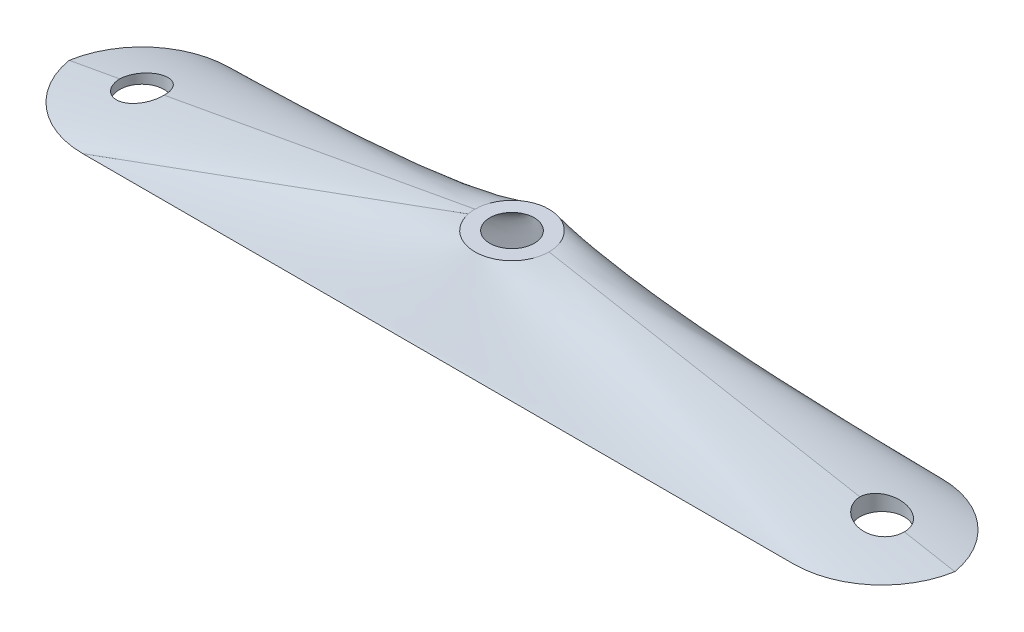
ISO-10303-21;
HEADER;
FILE_DESCRIPTION(('STEP AP214'),'2;1');
FILE_NAME('part.step','',(''),(''),'','','');
FILE_SCHEMA(('AUTOMOTIVE_DESIGN { 1 0 10303 214 1 1 1 1 }'));
ENDSEC;
DATA;
#1=APPLICATION_CONTEXT('core data for automotive mechanical design processes');
#2=APPLICATION_PROTOCOL_DEFINITION('international standard','automotive_design',2000,#1);
#3=PRODUCT_CONTEXT('',#1,'mechanical');
#4=PRODUCT('Part','Part','',(#3));
#5=PRODUCT_RELATED_PRODUCT_CATEGORY('part','',(#4));
#6=PRODUCT_DEFINITION_FORMATION('','',#4);
#7=PRODUCT_DEFINITION_CONTEXT('part definition',#1,'design');
#8=PRODUCT_DEFINITION('design','',#6,#7);
#9=PRODUCT_DEFINITION_SHAPE('','',#8);
#10=(LENGTH_UNIT() NAMED_UNIT(*) SI_UNIT(.MILLI.,.METRE.));
#11=(NAMED_UNIT(*) PLANE_ANGLE_UNIT() SI_UNIT($,.RADIAN.));
#12=(NAMED_UNIT(*) SI_UNIT($,.STERADIAN.) SOLID_ANGLE_UNIT());
#13=UNCERTAINTY_MEASURE_WITH_UNIT(LENGTH_MEASURE(1.E-05),#10,'distance_accuracy_value','');
#14=(GEOMETRIC_REPRESENTATION_CONTEXT(3) GLOBAL_UNCERTAINTY_ASSIGNED_CONTEXT((#13)) GLOBAL_UNIT_ASSIGNED_CONTEXT((#10,
#11,#12)) REPRESENTATION_CONTEXT('',''));
#15=CARTESIAN_POINT('',(0.,0.,0.));
#16=DIRECTION('',(0.,0.,1.));
#17=DIRECTION('',(1.,0.,0.));
#18=AXIS2_PLACEMENT_3D('',#15,#16,#17);
#19=CARTESIAN_POINT('',(24.,0.,-0.999999999999999));
#20=DIRECTION('',(0.,1.,0.));
#21=DIRECTION('',(0.,0.,1.));
#22=AXIS2_PLACEMENT_3D('',#19,#20,#21);
#23=PLANE('',#22);
#24=DIRECTION('',(0.,0.,1.));
#25=VECTOR('',#24,1.);
#26=CARTESIAN_POINT('',(-21.,0.,-2.));
#27=LINE('',#26,#25);
#28=CARTESIAN_POINT('',(-21.,0.,-2.));
#29=VERTEX_POINT('',#28);
#30=CARTESIAN_POINT('',(-21.,0.,2.));
#31=VERTEX_POINT('',#30);
#32=EDGE_CURVE('E391',#29,#31,#27,.T.);
#33=ORIENTED_EDGE('',*,*,#32,.T.);
#34=DIRECTION('',(1.,0.,0.));
#35=VECTOR('',#34,1.);
#36=CARTESIAN_POINT('',(-21.,0.,2.));
#37=LINE('',#36,#35);
#38=CARTESIAN_POINT('',(21.,0.,2.));
#39=VERTEX_POINT('',#38);
#40=EDGE_CURVE('E156',#31,#39,#37,.T.);
#41=ORIENTED_EDGE('',*,*,#40,.T.);
#42=DIRECTION('',(0.,0.,-1.));
#43=VECTOR('',#42,1.);
#44=CARTESIAN_POINT('',(21.,0.,-2.));
#45=LINE('',#44,#43);
#46=CARTESIAN_POINT('',(21.,0.,-2.));
#47=VERTEX_POINT('',#46);
#48=EDGE_CURVE('E241',#39,#47,#45,.T.);
#49=ORIENTED_EDGE('',*,*,#48,.T.);
#50=DIRECTION('',(-1.,0.,0.));
#51=VECTOR('',#50,1.);
#52=CARTESIAN_POINT('',(-21.,0.,-2.));
#53=LINE('',#52,#51);
#54=EDGE_CURVE('E299',#47,#29,#53,.T.);
#55=ORIENTED_EDGE('',*,*,#54,.T.);
#56=EDGE_LOOP('',(#33,#41,#49,#55));
#57=FACE_BOUND('',#56,.T.);
#58=CARTESIAN_POINT('',(25.,0.,0.));
#59=DIRECTION('',(0.,1.,0.));
#60=DIRECTION('',(0.,0.,1.));
#61=AXIS2_PLACEMENT_3D('',#58,#59,#60);
#62=CIRCLE('',#61,1.5);
#63=CARTESIAN_POINT('',(25.,0.,1.49999999999999));
#64=VERTEX_POINT('',#63);
#65=EDGE_CURVE('E406',#64,#64,#62,.T.);
#66=ORIENTED_EDGE('',*,*,#65,.T.);
#67=EDGE_LOOP('',(#66));
#68=FACE_BOUND('',#67,.T.);
#69=CARTESIAN_POINT('',(24.,0.,-0.999999999999999));
#70=DIRECTION('',(0.,1.,0.));
#71=DIRECTION('',(0.,0.,1.));
#72=AXIS2_PLACEMENT_3D('',#69,#70,#71);
#73=CIRCLE('',#72,6.);
#74=CARTESIAN_POINT('',(24.,0.,5.));
#75=VERTEX_POINT('',#74);
#76=CARTESIAN_POINT('',(29.9160797830996,0.,0.));
#77=VERTEX_POINT('',#76);
#78=EDGE_CURVE('E568',#75,#77,#73,.T.);
#79=ORIENTED_EDGE('',*,*,#78,.F.);
#80=DIRECTION('',(1.,0.,0.));
#81=VECTOR('',#80,1.);
#82=CARTESIAN_POINT('',(-24.,0.,5.));
#83=LINE('',#82,#81);
#84=CARTESIAN_POINT('',(-24.,0.,5.));
#85=VERTEX_POINT('',#84);
#86=EDGE_CURVE('E554',#85,#75,#83,.T.);
#87=ORIENTED_EDGE('',*,*,#86,.F.);
#88=CARTESIAN_POINT('',(-24.,0.,-1.));
#89=DIRECTION('',(0.,1.,0.));
#90=DIRECTION('',(0.,0.,1.));
#91=AXIS2_PLACEMENT_3D('',#88,#89,#90);
#92=CIRCLE('',#91,6.);
#93=CARTESIAN_POINT('',(-29.9160797830996,0.,0.));
#94=VERTEX_POINT('',#93);
#95=EDGE_CURVE('E550',#94,#85,#92,.T.);
#96=ORIENTED_EDGE('',*,*,#95,.F.);
#97=CARTESIAN_POINT('',(-24.,0.,1.));
#98=DIRECTION('',(0.,1.,0.));
#99=DIRECTION('',(0.,0.,1.));
#100=AXIS2_PLACEMENT_3D('',#97,#98,#99);
#101=CIRCLE('',#100,6.);
#102=CARTESIAN_POINT('',(-24.,0.,-5.));
#103=VERTEX_POINT('',#102);
#104=EDGE_CURVE('E535',#103,#94,#101,.T.);
#105=ORIENTED_EDGE('',*,*,#104,.F.);
#106=DIRECTION('',(1.,0.,0.));
#107=VECTOR('',#106,1.);
#108=CARTESIAN_POINT('',(-24.,0.,-5.));
#109=LINE('',#108,#107);
#110=CARTESIAN_POINT('',(24.,0.,-5.));
#111=VERTEX_POINT('',#110);
#112=EDGE_CURVE('E524',#103,#111,#109,.T.);
#113=ORIENTED_EDGE('',*,*,#112,.T.);
#114=CARTESIAN_POINT('',(24.,0.,1.));
#115=DIRECTION('',(0.,-1.,0.));
#116=DIRECTION('',(0.,0.,-1.));
#117=AXIS2_PLACEMENT_3D('',#114,#115,#116);
#118=CIRCLE('',#117,6.);
#119=EDGE_CURVE('E513',#111,#77,#118,.T.);
#120=ORIENTED_EDGE('',*,*,#119,.T.);
#121=EDGE_LOOP('',(#79,#87,#96,#105,#113,#120));
#122=FACE_BOUND('',#121,.T.);
#123=CARTESIAN_POINT('',(-25.,0.,0.));
#124=DIRECTION('',(0.,1.,0.));
#125=DIRECTION('',(0.,0.,1.));
#126=AXIS2_PLACEMENT_3D('',#123,#124,#125);
#127=CIRCLE('',#126,1.5);
#128=CARTESIAN_POINT('',(-25.,0.,1.5));
#129=VERTEX_POINT('',#128);
#130=EDGE_CURVE('E264',#129,#129,#127,.T.);
#131=ORIENTED_EDGE('',*,*,#130,.T.);
#132=EDGE_LOOP('',(#131));
#133=FACE_BOUND('',#132,.T.);
#134=ADVANCED_FACE('F151',(#57,#68,#122,#133),#23,.F.);
#135=CARTESIAN_POINT('',(29.9160797830996,0.,0.));
#136=CARTESIAN_POINT('',(2.5,5.,0.));
#137=CARTESIAN_POINT('',(29.8576069399161,0.,-0.345930005418267));
#138=CARTESIAN_POINT('',(2.5,5.,-0.0213953530212336));
#139=CARTESIAN_POINT('',(29.6739535574753,0.,-1.06141026314804));
#140=CARTESIAN_POINT('',(2.49944265383587,5.,-0.0625543013431825));
#141=CARTESIAN_POINT('',(29.1630847247937,0.,-2.13603988544615));
#142=CARTESIAN_POINT('',(2.49722734976918,5.,-0.12103731016739));
#143=CARTESIAN_POINT('',(28.4277559052906,0.,-3.10895181990004));
#144=CARTESIAN_POINT('',(2.49392551455387,5.,-0.17790476483572));
#145=CARTESIAN_POINT('',(27.5395613102074,0.,-3.88951021670276));
#146=CARTESIAN_POINT('',(2.48921396726683,4.99999999999999,-0.235103940194016));
#147=CARTESIAN_POINT('',(26.5934125945931,0.,-4.44399398395558));
#148=CARTESIAN_POINT('',(2.48276952698495,5.,-0.294582111088122));
#149=CARTESIAN_POINT('',(25.6628136034882,0.,-4.7904265958617));
#150=CARTESIAN_POINT('',(2.47456553986549,5.,-0.356902074488963));
#151=CARTESIAN_POINT('',(24.7884785601569,0.,-4.96786078241977));
#152=CARTESIAN_POINT('',(2.46457535206569,5.,-0.422626627367463));
#153=CARTESIAN_POINT('',(24.2543127953814,0.,-5.));
#154=CARTESIAN_POINT('',(2.45419931934819,5.,-0.477493939259954));
#155=CARTESIAN_POINT('',(21.903475735512,0.,-5.));
#156=CARTESIAN_POINT('',(2.39181911951797,5.,-0.776918898445019));
#157=CARTESIAN_POINT('',(17.7877435421834,0.,-5.));
#158=CARTESIAN_POINT('',(2.19056393390965,4.99999999999999,-1.30083484455612));
#159=CARTESIAN_POINT('',(11.7782607328345,0.,-5.));
#160=CARTESIAN_POINT('',(1.63222763938408,5.00000000000001,-1.95877479182776));
#161=CARTESIAN_POINT('',(5.86505987783089,0.,-5.));
#162=CARTESIAN_POINT('',(0.871931661804083,4.99999999999999,-2.3973297100366));
#163=CARTESIAN_POINT('',(0.,0.,-5.));
#164=CARTESIAN_POINT('',(0.,5.00000000000001,-2.55144611330746));
#165=CARTESIAN_POINT('',(-5.86505987783087,0.,-5.));
#166=CARTESIAN_POINT('',(-0.871931661804084,4.99999999999999,-2.3973297100366));
#167=CARTESIAN_POINT('',(-11.7782607328345,0.,-5.));
#168=CARTESIAN_POINT('',(-1.63222763938409,5.00000000000001,-1.95877479182776));
#169=CARTESIAN_POINT('',(-17.7877435421834,0.,-5.));
#170=CARTESIAN_POINT('',(-2.19056393390965,4.99999999999999,-1.30083484455612));
#171=CARTESIAN_POINT('',(-21.903475735512,0.,-5.));
#172=CARTESIAN_POINT('',(-2.39181911951797,5.,-0.776918898445019));
#173=CARTESIAN_POINT('',(-24.2543127953814,0.,-5.));
#174=CARTESIAN_POINT('',(-2.45419931934819,5.,-0.477493939259956));
#175=CARTESIAN_POINT('',(-24.7884785601569,0.,-4.96786078241976));
#176=CARTESIAN_POINT('',(-2.46457535206569,5.,-0.422626627367464));
#177=CARTESIAN_POINT('',(-25.6628136034882,0.,-4.79042659586171));
#178=CARTESIAN_POINT('',(-2.47456553986549,5.,-0.356902074488964));
#179=CARTESIAN_POINT('',(-26.593412594593,0.,-4.44399398395558));
#180=CARTESIAN_POINT('',(-2.48276952698495,5.,-0.294582111088123));
#181=CARTESIAN_POINT('',(-27.5395613102074,0.,-3.88951021670275));
#182=CARTESIAN_POINT('',(-2.48921396726683,5.,-0.235103940194017));
#183=CARTESIAN_POINT('',(-28.4277559052906,0.,-3.10895181990002));
#184=CARTESIAN_POINT('',(-2.49392551455387,5.,-0.17790476483572));
#185=CARTESIAN_POINT('',(-29.1630847247937,0.,-2.13603988544614));
#186=CARTESIAN_POINT('',(-2.49722734976919,5.,-0.12103731016739));
#187=CARTESIAN_POINT('',(-29.6739535574753,0.,-1.06141026314803));
#188=CARTESIAN_POINT('',(-2.49944265383587,5.,-0.0625543013431825));
#189=CARTESIAN_POINT('',(-29.8576069399161,0.,-0.345930005418259));
#190=CARTESIAN_POINT('',(-2.5,5.,-0.0213953530212336));
#191=CARTESIAN_POINT('',(-29.9160797830996,0.,0.));
#192=CARTESIAN_POINT('',(-2.5,5.,0.));
#193=B_SPLINE_SURFACE_WITH_KNOTS('',3,1,((#135,#136),(#137,#138),(#139,#140),(#141,#142),(#143,
#144),(#145,#146),(#147,#148),(#149,#150),(#151,#152),(#153,#154),(#155,#156),(#157,#158),(#159,
#160),(#161,#162),(#163,#164),(#165,#166),(#167,#168),(#169,#170),(#171,#172),(#173,#174),(#175,
#176),(#177,#178),(#179,#180),(#181,#182),(#183,#184),(#185,#186),(#187,#188),(#189,#190),(#191,
#192)),.UNSPECIFIED.,.F.,.F.,.F.,(4,1,1,1,1,1,1,1,2,1,1,1,1,1,1,1,2,1,1,1,1,1,1,1,4),(2,2),(0.,
0.0122024073057627,0.0244048146115255,0.0366072219172882,0.0488096292230509,0.0610120365288137,
0.0732144438345764,0.0854168511403391,0.0976192584461019,0.198214443834576,0.298809629223051,
0.399404814611525,0.5,0.600595185388475,0.701190370776949,0.801785556165424,0.902380741553898,
0.914583148859661,0.926785556165423,0.938987963471186,0.951190370776949,0.963392778082712,
0.975595185388475,0.987797592694237,1.),(0.,1.),.UNSPECIFIED.);
#194=DIRECTION('',(0.983773405242329,0.179415403847921,0.));
#195=VECTOR('',#194,1.);
#196=CARTESIAN_POINT('',(-16.2080398915498,2.5,0.));
#197=LINE('',#196,#195);
#198=CARTESIAN_POINT('',(-26.5,0.623006609647637,0.));
#199=VERTEX_POINT('',#198);
#200=EDGE_CURVE('E540',#94,#199,#197,.T.);
#201=CARTESIAN_POINT('',(-26.5,0.623006609647637,0.));
#202=CARTESIAN_POINT('',(-26.4999998743897,0.62172910550306,-0.0418189708600754));
#203=CARTESIAN_POINT('',(-26.4982500459415,0.620676120662407,-0.0836249605767046));
#204=CARTESIAN_POINT('',(-26.4912668133967,0.619027661504748,-0.166952268218727));
#205=CARTESIAN_POINT('',(-26.4860335498904,0.618432168725603,-0.208473597564593));
#206=CARTESIAN_POINT('',(-26.4651549900874,0.617345696551539,-0.332092330074409));
#207=CARTESIAN_POINT('',(-26.4443308020649,0.617550480349324,-0.413383326001903));
#208=CARTESIAN_POINT('',(-26.3894513516417,0.619880070847785,-0.57133933385011));
#209=CARTESIAN_POINT('',(-26.3553894685041,0.622005839020947,-0.648002008748126));
#210=CARTESIAN_POINT('',(-26.2750314448184,0.628224976518404,-0.794525571839239));
#211=CARTESIAN_POINT('',(-26.2287378255027,0.632317940502171,-0.864387857687406));
#212=CARTESIAN_POINT('',(-26.1252574919269,0.642504453747967,-0.99537181675843));
#213=CARTESIAN_POINT('',(-26.0680680758812,0.648598499481718,-1.0564913154733));
#214=CARTESIAN_POINT('',(-25.9444696758924,0.66280116410627,-1.16829896629494));
#215=CARTESIAN_POINT('',(-25.8780591470789,0.670910120747769,-1.21898536694006));
#216=CARTESIAN_POINT('',(-25.7376018153849,0.689145757592799,-1.30878832374084));
#217=CARTESIAN_POINT('',(-25.6635181499454,0.699282418558914,-1.34784517167671));
#218=CARTESIAN_POINT('',(-25.5101424184695,0.721433858396896,-1.41304614638015));
#219=CARTESIAN_POINT('',(-25.4308504465361,0.733448603341222,-1.43919050637602));
#220=CARTESIAN_POINT('',(-25.2683802716908,0.759305509552603,-1.47818455966865));
#221=CARTESIAN_POINT('',(-25.1851682791829,0.773166786444903,-1.49088068500494));
#222=CARTESIAN_POINT('',(-25.0180381576904,0.80230738701011,-1.50222926028419));
#223=CARTESIAN_POINT('',(-24.9341199504764,0.817586869713198,-1.5008801333759));
#224=CARTESIAN_POINT('',(-24.7665274514225,0.84941229511642,-1.48414746368594));
#225=CARTESIAN_POINT('',(-24.6828786569812,0.865974619220452,-1.46853918273686));
#226=CARTESIAN_POINT('',(-24.519512266627,0.899614788075291,-1.42348774701228));
#227=CARTESIAN_POINT('',(-24.4397950394074,0.916692680933768,-1.3940432974283));
#228=CARTESIAN_POINT('',(-24.2853823084191,0.95099017653906,-1.32162019577626));
#229=CARTESIAN_POINT('',(-24.2107681271329,0.968208624147053,-1.2784659759435));
#230=CARTESIAN_POINT('',(-24.1051938685166,0.993417405888537,-1.20464627436589));
#231=CARTESIAN_POINT('',(-24.0710548721857,1.00171858176494,-1.17851961675077));
#232=CARTESIAN_POINT('',(-24.0050663919763,1.01804083594838,-1.12336887117912));
#233=CARTESIAN_POINT('',(-23.9732193681032,1.02606160868475,-1.09434174760343));
#234=CARTESIAN_POINT('',(-23.881661901733,1.04952167615035,-1.00334635409865));
#235=CARTESIAN_POINT('',(-23.8257437154181,1.06440476006868,-0.937330141058736));
#236=CARTESIAN_POINT('',(-23.7259236654144,1.09193701781833,-0.796355928783183));
#237=CARTESIAN_POINT('',(-23.6820186860421,1.10458677057241,-0.721400255295108));
#238=CARTESIAN_POINT('',(-23.6266396918862,1.12130623218727,-0.604727251383807));
#239=CARTESIAN_POINT('',(-23.6100377469512,1.12646430166789,-0.565526933372189));
#240=CARTESIAN_POINT('',(-23.5802084408856,1.13603440946633,-0.485797716996678));
#241=CARTESIAN_POINT('',(-23.5669784110916,1.14044703681722,-0.445269898118525));
#242=CARTESIAN_POINT('',(-23.5440163540445,1.14847114268338,-0.363215570544322));
#243=CARTESIAN_POINT('',(-23.5342800525531,1.15208359804552,-0.321690348924266));
#244=CARTESIAN_POINT('',(-23.5183737547473,1.15847200837184,-0.237908097485299));
#245=CARTESIAN_POINT('',(-23.5122025127761,1.16124825535063,-0.195651328595962));
#246=CARTESIAN_POINT('',(-23.5052301834282,1.1649955767869,-0.127742986944667));
#247=CARTESIAN_POINT('',(-23.5032681895719,1.16624428432764,-0.102220174296166));
#248=CARTESIAN_POINT('',(-23.5006539685504,1.16842489093066,-0.0511342084233681));
#249=CARTESIAN_POINT('',(-23.499999696597,1.16935728269395,-0.0255711808255543));
#250=CARTESIAN_POINT('',(-23.4999999999999,1.1701307834417,0.));
#251=B_SPLINE_CURVE_WITH_KNOTS('',3,(#201,#202,#203,#204,#205,#206,#207,#208,#209,#210,#211,
#212,#213,#214,#215,#216,#217,#218,#219,#220,#221,#222,#223,#224,#225,#226,#227,#228,#229,#230,
#231,#232,#233,#234,#235,#236,#237,#238,#239,#240,#241,#242,#243,#244,#245,#246,#247,#248,#249,
#250),.UNSPECIFIED.,.F.,.F.,(4,2,2,2,2,2,2,2,2,2,2,2,2,2,2,2,2,2,2,2,2,2,2,2,4),(0.,
0.125438728943334,0.250872395528046,0.501328292608193,0.751909614919592,1.00243932709193,
1.25303124312694,1.5036651931591,1.7555645931109,2.007459443032,2.26220070209884,
2.51697056110809,2.77582644141553,3.03470655065296,3.29704542705875,3.42826074586477,
3.55961486199715,3.82161825209999,4.08355362580487,4.21206823370931,4.34048081213585,
4.468735750243,4.59694584802877,4.6737992901233,4.75053246785094),.UNSPECIFIED.);
#252=CARTESIAN_POINT('',(-23.5,1.17013078344168,0.));
#253=VERTEX_POINT('',#252);
#254=EDGE_CURVE('E400',#199,#253,#251,.T.);
#255=CARTESIAN_POINT('',(-2.5,5.,0.));
#256=VERTEX_POINT('',#255);
#257=EDGE_CURVE('E426',#253,#256,#197,.T.);
#258=CARTESIAN_POINT('',(0.,5.,0.));
#259=DIRECTION('',(0.,1.,0.));
#260=DIRECTION('',(0.,0.,1.));
#261=AXIS2_PLACEMENT_3D('',#258,#259,#260);
#262=CIRCLE('',#261,2.5);
#263=CARTESIAN_POINT('',(2.5,5.,0.));
#264=VERTEX_POINT('',#263);
#265=EDGE_CURVE('E469',#264,#256,#262,.T.);
#266=DIRECTION('',(-0.983773405242329,0.179415403847921,0.));
#267=VECTOR('',#266,1.);
#268=CARTESIAN_POINT('',(16.2080398915498,2.5,0.));
#269=LINE('',#268,#267);
#270=CARTESIAN_POINT('',(23.5,1.17013078344168,0.));
#271=VERTEX_POINT('',#270);
#272=EDGE_CURVE('E491',#271,#264,#269,.T.);
#273=CARTESIAN_POINT('',(23.5,1.17013078344168,0.));
#274=CARTESIAN_POINT('',(23.4999990055124,1.16887244974125,-0.0416163962723675));
#275=CARTESIAN_POINT('',(23.5017327878285,1.16719266962609,-0.0832006210960265));
#276=CARTESIAN_POINT('',(23.5086380171164,1.16300954066388,-0.16603275531397));
#277=CARTESIAN_POINT('',(23.5138087824821,1.16050635516036,-0.207280729750348));
#278=CARTESIAN_POINT('',(23.5343937803506,1.15180487766047,-0.329922813625943));
#279=CARTESIAN_POINT('',(23.5548810863767,1.14440786602526,-0.410435745184424));
#280=CARTESIAN_POINT('',(23.6087094476079,1.12673833529857,-0.5666933870399));
#281=CARTESIAN_POINT('',(23.6420503473457,1.11646585098707,-0.642438154996132));
#282=CARTESIAN_POINT('',(23.7008356108937,1.0992645742903,-0.750912093947971));
#283=CARTESIAN_POINT('',(23.7219000457348,1.0932301433054,-0.786221909068305));
#284=CARTESIAN_POINT('',(23.7668219814728,1.0806226700505,-0.854961488519094));
#285=CARTESIAN_POINT('',(23.7906819255418,1.07404915817175,-0.888389569943044));
#286=CARTESIAN_POINT('',(23.8670286251157,1.05340592791849,-0.986567628472779));
#287=CARTESIAN_POINT('',(23.923639201553,1.03860332051024,-1.04802614418805));
#288=CARTESIAN_POINT('',(24.0460731232658,1.00772998401198,-1.16057793008955));
#289=CARTESIAN_POINT('',(24.1118981077364,0.991659029512012,-1.21166935205389));
#290=CARTESIAN_POINT('',(24.2170648719994,0.966886309641801,-1.28016813750353));
#291=CARTESIAN_POINT('',(24.2537199595903,0.958401199144179,-1.30187413078569));
#292=CARTESIAN_POINT('',(24.3286894426985,0.941361973347474,-1.34206930616426));
#293=CARTESIAN_POINT('',(24.3670022167477,0.932807931854102,-1.3605615467592));
#294=CARTESIAN_POINT('',(24.4841218979899,0.90714827533164,-1.41105868403802));
#295=CARTESIAN_POINT('',(24.5651367121102,0.890038841018895,-1.43810124577735));
#296=CARTESIAN_POINT('',(24.7315556529251,0.856277450908081,-1.47829368394371));
#297=CARTESIAN_POINT('',(24.8169976253152,0.839632397342551,-1.49129096388559));
#298=CARTESIAN_POINT('',(24.989079013734,0.807515953255104,-1.50243476339974));
#299=CARTESIAN_POINT('',(25.0757184188531,0.792044552048495,-1.50058141818547));
#300=CARTESIAN_POINT('',(25.2469828004204,0.762813506984785,-1.48201214902406));
#301=CARTESIAN_POINT('',(25.3316182324852,0.749041421087427,-1.46541258618189));
#302=CARTESIAN_POINT('',(25.4970467996433,0.723367401076671,-1.4178692703339));
#303=CARTESIAN_POINT('',(25.5778402838678,0.71146529680422,-1.38692682347275));
#304=CARTESIAN_POINT('',(25.7319036619169,0.689892912995107,-1.31206800553675));
#305=CARTESIAN_POINT('',(25.8052744503639,0.680189520201958,-1.26837054815775));
#306=CARTESIAN_POINT('',(25.9090181203322,0.667209280644687,-1.19394498870273));
#307=CARTESIAN_POINT('',(25.9425518266732,0.663144516225288,-1.1676519507305));
#308=CARTESIAN_POINT('',(26.0073305437786,0.655535380126306,-1.11225128017766));
#309=CARTESIAN_POINT('',(26.0385732561092,0.651991527565287,-1.08314088720114));
#310=CARTESIAN_POINT('',(26.1275628359912,0.642247794153419,-0.992806726668506));
#311=CARTESIAN_POINT('',(26.1816420858412,0.636803549638195,-0.927808943312896));
#312=CARTESIAN_POINT('',(26.2781607988918,0.627945556463901,-0.789563983079695));
#313=CARTESIAN_POINT('',(26.3206013985936,0.624531609510475,-0.716317612653434));
#314=CARTESIAN_POINT('',(26.374468811164,0.62091086496187,-0.60216044134114));
#315=CARTESIAN_POINT('',(26.390760660185,0.619954573214684,-0.563506374570518));
#316=CARTESIAN_POINT('',(26.4200453149559,0.618526256885001,-0.485001979311077));
#317=CARTESIAN_POINT('',(26.4330407955717,0.618053838707349,-0.445152650283458));
#318=CARTESIAN_POINT('',(26.4669159578352,0.617353938603754,-0.324244983677833));
#319=CARTESIAN_POINT('',(26.482756824367,0.617839043411815,-0.241673125351246));
#320=CARTESIAN_POINT('',(26.4944031418302,0.619687456745152,-0.132165350397939));
#321=CARTESIAN_POINT('',(26.4965031635354,0.620224629078121,-0.105749950654129));
#322=CARTESIAN_POINT('',(26.4992992760538,0.621480331208117,-0.0528935351899835));
#323=CARTESIAN_POINT('',(26.4999977104562,0.622198556000061,-0.0264526363163654));
#324=CARTESIAN_POINT('',(26.5000000000001,0.623006609647621,0.));
#325=B_SPLINE_CURVE_WITH_KNOTS('',3,(#273,#274,#275,#276,#277,#278,#279,#280,#281,#282,#283,
#284,#285,#286,#287,#288,#289,#290,#291,#292,#293,#294,#295,#296,#297,#298,#299,#300,#301,#302,
#303,#304,#305,#306,#307,#308,#309,#310,#311,#312,#313,#314,#315,#316,#317,#318,#319,#320,#321,
#322,#323,#324),.UNSPECIFIED.,.F.,.F.,(4,2,2,2,2,2,2,2,2,2,2,2,2,2,2,2,2,2,2,2,2,2,2,2,2,4),(0.,
0.124830020515418,0.249635292719342,0.498592211517164,0.747546119213432,0.872091861661552,
0.996747276048309,1.2500932168264,1.50348428393657,1.63366021218493,1.76371156659404,
2.02371864462089,2.28652304436737,2.54932505130882,2.81007155119858,3.07079431069125,
3.32728187916504,3.45556425642934,3.58397362010861,3.83686616054474,4.08973399750694,
4.21547333950836,4.34111032048539,4.59188002222927,4.67136962408625,4.75072620054595),.UNSPECIFIED.);
#326=CARTESIAN_POINT('',(26.5,0.62300660964764,0.));
#327=VERTEX_POINT('',#326);
#328=EDGE_CURVE('E162',#271,#327,#325,.T.);
#329=EDGE_CURVE('E498',#77,#327,#269,.T.);
#330=ORIENTED_EDGE('',*,*,#200,.T.);
#331=ORIENTED_EDGE('',*,*,#254,.T.);
#332=ORIENTED_EDGE('',*,*,#257,.T.);
#333=ORIENTED_EDGE('',*,*,#265,.F.);
#334=ORIENTED_EDGE('',*,*,#272,.F.);
#335=ORIENTED_EDGE('',*,*,#328,.T.);
#336=ORIENTED_EDGE('',*,*,#329,.F.);
#337=ORIENTED_EDGE('',*,*,#119,.F.);
#338=ORIENTED_EDGE('',*,*,#112,.F.);
#339=ORIENTED_EDGE('',*,*,#104,.T.);
#340=EDGE_LOOP('',(#330,#331,#332,#333,#334,#335,#336,#337,#338,#339));
#341=FACE_BOUND('',#340,.T.);
#342=ADVANCED_FACE('F314',(#341),#193,.T.);
#343=CARTESIAN_POINT('',(-29.9160797830996,0.,0.));
#344=CARTESIAN_POINT('',(-2.5,5.,0.));
#345=CARTESIAN_POINT('',(-29.4283201494261,0.,2.88562490778812));
#346=CARTESIAN_POINT('',(-2.5,5.,0.171312223353755));
#347=CARTESIAN_POINT('',(-26.9265578020412,0.,5.));
#348=CARTESIAN_POINT('',(-2.4823909060784,5.,0.342174322954961));
#349=CARTESIAN_POINT('',(-24.,0.,5.));
#350=CARTESIAN_POINT('',(-2.44745104934401,5.,0.509885635280003));
#351=B_SPLINE_SURFACE_WITH_KNOTS('',3,1,((#343,#344),(#345,#346),(#347,#348),(#349,#350)),
.UNSPECIFIED.,.F.,.F.,.F.,(4,4),(2,2),(0.,1.),(0.,1.),.UNSPECIFIED.);
#352=CARTESIAN_POINT('',(-23.5,1.17013078344168,0.));
#353=CARTESIAN_POINT('',(-23.4999990059217,1.16887152196048,0.0416189344031349));
#354=CARTESIAN_POINT('',(-23.501732999575,1.16719261916546,0.0832057726741453));
#355=CARTESIAN_POINT('',(-23.5086391121327,1.1630135947006,0.166043278253204));
#356=CARTESIAN_POINT('',(-23.5138105529667,1.16051363504153,0.207294010237384));
#357=CARTESIAN_POINT('',(-23.5343983735954,1.15182343249517,0.329944740223334));
#358=CARTESIAN_POINT('',(-23.5548886222827,1.14443608561857,0.410463626477934));
#359=CARTESIAN_POINT('',(-23.6087251593269,1.12678792002075,0.566732986329323));
#360=CARTESIAN_POINT('',(-23.6420713310124,1.1165271273771,0.642483503193178));
#361=CARTESIAN_POINT('',(-23.7008663029489,1.09934643144347,0.750965402824763));
#362=CARTESIAN_POINT('',(-23.7219342590849,1.09331937476611,0.78627774092438));
#363=CARTESIAN_POINT('',(-23.766863906307,1.08072815643662,0.85502215458776));
#364=CARTESIAN_POINT('',(-23.7907280407293,1.07416352657707,0.888452547354115));
#365=CARTESIAN_POINT('',(-23.8670850065256,1.05354788922268,0.986632664864866));
#366=CARTESIAN_POINT('',(-23.9237017971246,1.03876389218198,1.04809067251872));
#367=CARTESIAN_POINT('',(-24.0461475177322,1.00792094199789,1.16063932377743));
#368=CARTESIAN_POINT('',(-24.111978086556,0.991861762263554,1.21172811908549));
#369=CARTESIAN_POINT('',(-24.2171485408967,0.967103262365083,1.28021919440723));
#370=CARTESIAN_POINT('',(-24.2538020442842,0.958622790934876,1.30192106474793));
#371=CARTESIAN_POINT('',(-24.3287676539575,0.941591531544038,1.34210831106658));
#372=CARTESIAN_POINT('',(-24.3670781392714,0.933040818649157,1.36059674557403));
#373=CARTESIAN_POINT('',(-24.484190028924,0.907389509964173,1.41108313719679));
#374=CARTESIAN_POINT('',(-24.5651983637084,0.890283472441014,1.43811939613062));
#375=CARTESIAN_POINT('',(-24.7316088482863,0.856524533291335,1.47830322950464));
#376=CARTESIAN_POINT('',(-24.8170490958568,0.839878549888748,1.4912971408807));
#377=CARTESIAN_POINT('',(-24.9891261021834,0.807758212627922,1.50243496909127));
#378=CARTESIAN_POINT('',(-25.0757628497008,0.792283847773588,1.50057902531487));
#379=CARTESIAN_POINT('',(-25.2470249940425,0.763044907941986,1.48200516750757));
#380=CARTESIAN_POINT('',(-25.3316607955867,0.749267966562602,1.46540300081642));
#381=CARTESIAN_POINT('',(-25.4970895383542,0.723582694397343,1.41785433830287));
#382=CARTESIAN_POINT('',(-25.5778828259605,0.711674194957636,1.3869091381443));
#383=CARTESIAN_POINT('',(-25.7319462246559,0.690085609379294,1.31204438955473));
#384=CARTESIAN_POINT('',(-25.8053171506631,0.680372494539666,1.26834355405968));
#385=CARTESIAN_POINT('',(-25.9090603403015,0.667374252134377,1.1939128734935));
#386=CARTESIAN_POINT('',(-25.9425937666288,0.663302916137086,1.16761812466296));
#387=CARTESIAN_POINT('',(-26.0073717269073,0.655679594980342,1.11221401278142));
#388=CARTESIAN_POINT('',(-26.0386139620976,0.65212812794422,1.08310188916118));
#389=CARTESIAN_POINT('',(-26.1276038508193,0.642361357140222,0.992760521869018));
#390=CARTESIAN_POINT('',(-26.1816833746414,0.636901546736457,0.927756818059279));
#391=CARTESIAN_POINT('',(-26.2782011879119,0.628018049421878,0.789499114806748));
#392=CARTESIAN_POINT('',(-26.3206406177541,0.624594163010769,0.716245924568505));
#393=CARTESIAN_POINT('',(-26.374503442811,0.620959548963399,0.602081348625343));
#394=CARTESIAN_POINT('',(-26.390792849047,0.619998827083918,0.563426884104372));
#395=CARTESIAN_POINT('',(-26.4200726601256,0.618561867160931,0.484921859107078));
#396=CARTESIAN_POINT('',(-26.433065739461,0.618085235399076,0.445072297826251));
#397=CARTESIAN_POINT('',(-26.4669337392701,0.617372980233686,0.324164247854728));
#398=CARTESIAN_POINT('',(-26.4827699149231,0.617850208706707,0.24159246761276));
#399=CARTESIAN_POINT('',(-26.4944088202916,0.619692072452122,0.132098413157894));
#400=CARTESIAN_POINT('',(-26.4965067119544,0.620227718025404,0.105696342418225));
#401=CARTESIAN_POINT('',(-26.4992999878662,0.621481177051346,0.0528666732682709));
#402=CARTESIAN_POINT('',(-26.499997712473,0.622198684259703,0.0264391914498094));
#403=CARTESIAN_POINT('',(-26.5,0.623006609647637,0.));
#404=B_SPLINE_CURVE_WITH_KNOTS('',3,(#352,#353,#354,#355,#356,#357,#358,#359,#360,#361,#362,
#363,#364,#365,#366,#367,#368,#369,#370,#371,#372,#373,#374,#375,#376,#377,#378,#379,#380,#381,
#382,#383,#384,#385,#386,#387,#388,#389,#390,#391,#392,#393,#394,#395,#396,#397,#398,#399,#400,
#401,#402,#403),.UNSPECIFIED.,.F.,.F.,(4,2,2,2,2,2,2,2,2,2,2,2,2,2,2,2,2,2,2,2,2,2,2,2,2,4),(0.,
0.124837769472589,0.249650920765132,0.498624508474808,0.747595836730841,0.872150136278317,
0.996814096222531,1.25016135315438,1.50355372927798,1.63371678729632,1.7637552702474,
2.0237367954112,2.28653531354458,2.54933136490609,2.81008270638061,3.07081049772865,
3.32730690273513,3.45559365424901,3.58400740373255,3.83691681674656,4.08980144306852,
4.21553935311719,4.34117491639245,4.59194151849031,4.67139070751598,4.75070698746072),.UNSPECIFIED.);
#405=EDGE_CURVE('E12',#253,#199,#404,.T.);
#406=DIRECTION('',(-0.954668551350484,-0.221474627789078,0.198889281531351));
#407=VECTOR('',#406,1.);
#408=CARTESIAN_POINT('',(-13.223725524672,2.5,2.75494281764));
#409=LINE('',#408,#407);
#410=CARTESIAN_POINT('',(-2.44745104934401,5.,0.509885635280003));
#411=VERTEX_POINT('',#410);
#412=EDGE_CURVE('E499',#411,#85,#409,.T.);
#413=EDGE_CURVE('E473',#256,#411,#262,.T.);
#414=ORIENTED_EDGE('',*,*,#257,.F.);
#415=ORIENTED_EDGE('',*,*,#405,.T.);
#416=ORIENTED_EDGE('',*,*,#200,.F.);
#417=ORIENTED_EDGE('',*,*,#95,.T.);
#418=ORIENTED_EDGE('',*,*,#412,.F.);
#419=ORIENTED_EDGE('',*,*,#413,.F.);
#420=EDGE_LOOP('',(#414,#415,#416,#417,#418,#419));
#421=FACE_BOUND('',#420,.T.);
#422=ADVANCED_FACE('F429',(#421),#351,.T.);
#423=CARTESIAN_POINT('',(-24.,0.,5.));
#424=CARTESIAN_POINT('',(-2.44745104934401,5.,0.509885635280003));
#425=CARTESIAN_POINT('',(-21.903475735512,0.,5.));
#426=CARTESIAN_POINT('',(-2.39181911951797,5.,0.776918898445019));
#427=CARTESIAN_POINT('',(-17.7877435421834,0.,5.));
#428=CARTESIAN_POINT('',(-2.19056393390965,4.99999999999999,1.30083484455612));
#429=CARTESIAN_POINT('',(-11.7782607328345,0.,5.));
#430=CARTESIAN_POINT('',(-1.63222763938409,5.00000000000002,1.95877479182776));
#431=CARTESIAN_POINT('',(-5.86505987783088,0.,5.));
#432=CARTESIAN_POINT('',(-0.871931661804082,4.99999999999999,2.3973297100366));
#433=CARTESIAN_POINT('',(0.,0.,5.));
#434=CARTESIAN_POINT('',(0.,5.00000000000001,2.55144611330745));
#435=CARTESIAN_POINT('',(5.86505987783089,0.,5.));
#436=CARTESIAN_POINT('',(0.87193166180408,5.,2.3973297100366));
#437=CARTESIAN_POINT('',(11.7782607328345,0.,5.));
#438=CARTESIAN_POINT('',(1.63222763938409,4.99999999999999,1.95877479182775));
#439=CARTESIAN_POINT('',(17.7877435421834,0.,5.));
#440=CARTESIAN_POINT('',(2.19056393390965,5.00000000000001,1.30083484455613));
#441=CARTESIAN_POINT('',(21.903475735512,0.,5.));
#442=CARTESIAN_POINT('',(2.39181911951797,5.,0.776918898445019));
#443=CARTESIAN_POINT('',(24.2543127953814,0.,5.));
#444=CARTESIAN_POINT('',(2.45419931934819,5.,0.477493939259955));
#445=CARTESIAN_POINT('',(24.8011177171286,0.,4.96833596090455));
#446=CARTESIAN_POINT('',(2.4640332690991,5.,0.425535893438965));
#447=CARTESIAN_POINT('',(25.7509816054598,0.,4.77068668506428));
#448=CARTESIAN_POINT('',(2.47282221438528,5.,0.367709512747765));
#449=CARTESIAN_POINT('',(26.8188178131963,0.,4.34492281485624));
#450=CARTESIAN_POINT('',(2.48067497176336,5.,0.311628469479811));
#451=CARTESIAN_POINT('',(27.9050031634527,0.,3.62046205364851));
#452=CARTESIAN_POINT('',(2.48722110482011,5.00000000000001,0.256333675758385));
#453=CARTESIAN_POINT('',(28.8003619990004,0.,2.67021231529134));
#454=CARTESIAN_POINT('',(2.49209017714228,5.,0.200866043706773));
#455=CARTESIAN_POINT('',(29.3981435377753,0.,1.68827226028396));
#456=CARTESIAN_POINT('',(2.49584044877773,4.99999999999999,0.144362197155219));
#457=CARTESIAN_POINT('',(29.7513389999875,0.,0.784635381848729));
#458=CARTESIAN_POINT('',(2.49903017977429,5.,0.0859587599339687));
#459=CARTESIAN_POINT('',(29.8736943172027,0.,0.25075579788987));
#460=CARTESIAN_POINT('',(2.5,5.,0.0330871745409679));
#461=CARTESIAN_POINT('',(29.9160797830996,0.,0.));
#462=CARTESIAN_POINT('',(2.5,5.,0.));
#463=B_SPLINE_SURFACE_WITH_KNOTS('',3,1,((#423,#424),(#425,#426),(#427,#428),(#429,#430),(#431,
#432),(#433,#434),(#435,#436),(#437,#438),(#439,#440),(#441,#442),(#443,#444),(#445,#446),(#447,
#448),(#449,#450),(#451,#452),(#453,#454),(#455,#456),(#457,#458),(#459,#460),(#461,#462)),
.UNSPECIFIED.,.F.,.F.,.F.,(4,1,1,1,1,1,1,1,2,1,1,1,1,1,1,1,4),(2,2),(0.,0.111477540195782,
0.222955080391565,0.334432620587347,0.445910160783129,0.557387700978911,0.668865241174694,
0.780342781370476,0.891820321566258,0.905342781370476,0.918865241174694,0.932387700978912,
0.945910160783129,0.959432620587347,0.972955080391565,0.986477540195782,1.),(0.,1.),.UNSPECIFIED.);
#464=CARTESIAN_POINT('',(26.5,0.62300660964764,0.));
#465=CARTESIAN_POINT('',(26.5000005714734,0.62174181078182,0.0418197202141731));
#466=CARTESIAN_POINT('',(26.4982502462079,0.620703773676975,0.0836279173319186));
#467=CARTESIAN_POINT('',(26.4912659458896,0.619086265011375,0.166957271853571));
#468=CARTESIAN_POINT('',(26.4860322945384,0.618506750851544,0.208478455567091));
#469=CARTESIAN_POINT('',(26.4651555383811,0.617464386156432,0.332094227883685));
#470=CARTESIAN_POINT('',(26.4443364993402,0.617693605290421,0.413377569411835));
#471=CARTESIAN_POINT('',(26.3894425723616,0.620066412413891,0.571353954694729));
#472=CARTESIAN_POINT('',(26.3553610568809,0.622210958228083,0.648044681277234));
#473=CARTESIAN_POINT('',(26.2951211574024,0.6269067370761,0.757898871839951));
#474=CARTESIAN_POINT('',(26.2735187632465,0.628718765416096,0.793656864433941));
#475=CARTESIAN_POINT('',(26.2274046424968,0.632840873641621,0.863262602556383));
#476=CARTESIAN_POINT('',(26.2028902308777,0.635151414808179,0.897108541985348));
#477=CARTESIAN_POINT('',(26.1252828770806,0.642832501371921,0.995333370278419));
#478=CARTESIAN_POINT('',(26.0680821353274,0.648955842190958,1.05647868751621));
#479=CARTESIAN_POINT('',(25.944453648298,0.663212298063113,1.16831337462046));
#480=CARTESIAN_POINT('',(25.8780253571332,0.671345532040816,1.21900212545027));
#481=CARTESIAN_POINT('',(25.7727911236088,0.685036297532417,1.28629208672897));
#482=CARTESIAN_POINT('',(25.7366541780748,0.689866560717192,1.30731892737663));
#483=CARTESIAN_POINT('',(25.662843937658,0.700006123601896,1.34624566106622));
#484=CARTESIAN_POINT('',(25.6251721533828,0.70531495824283,1.36414854122867));
#485=CARTESIAN_POINT('',(25.5101796841859,0.721948644238461,1.41302580919147));
#486=CARTESIAN_POINT('',(25.4308524358611,0.733984473583157,1.43918758369711));
#487=CARTESIAN_POINT('',(25.2683513029038,0.759878045501974,1.4781939850875));
#488=CARTESIAN_POINT('',(25.1851441278635,0.773754803181831,1.49088510752748));
#489=CARTESIAN_POINT('',(25.0180131843203,0.802925252602724,1.50222817234205));
#490=CARTESIAN_POINT('',(24.9340893359886,0.81821910411019,1.50087852981495));
#491=CARTESIAN_POINT('',(24.7664875984721,0.850069081568779,1.48414200808274));
#492=CARTESIAN_POINT('',(24.682835256644,0.86664152223006,1.46853027069347));
#493=CARTESIAN_POINT('',(24.5194609374535,0.900296946019113,1.42347053136251));
#494=CARTESIAN_POINT('',(24.4397393298067,0.917379976930008,1.3940212306247));
#495=CARTESIAN_POINT('',(24.2853205410603,0.951680899602805,1.32158711182815));
#496=CARTESIAN_POINT('',(24.2107045054212,0.968897553406125,1.27842709063013));
#497=CARTESIAN_POINT('',(24.1051274000483,0.994095007641832,1.20459698652849));
#498=CARTESIAN_POINT('',(24.0709874615373,1.00239096196479,1.17846659481065));
#499=CARTESIAN_POINT('',(24.0049971550463,1.01869913421832,1.12330767854352));
#500=CARTESIAN_POINT('',(23.9731492462191,1.02671104285174,1.09427611873781));
#501=CARTESIAN_POINT('',(23.8815971516518,1.05013564211798,1.00327389907526));
#502=CARTESIAN_POINT('',(23.8256841322917,1.0649854273208,0.937255381737717));
#503=CARTESIAN_POINT('',(23.7258743229445,1.09244021800247,0.796276851800847));
#504=CARTESIAN_POINT('',(23.6819744299653,1.10504580286406,0.721319155388665));
#505=CARTESIAN_POINT('',(23.6266059716751,1.12170019215822,0.604650228401469));
#506=CARTESIAN_POINT('',(23.6100087757699,1.12683668675369,0.565455218282263));
#507=CARTESIAN_POINT('',(23.5801879994908,1.13636172681529,0.485737363363422));
#508=CARTESIAN_POINT('',(23.5669617472196,1.14075086373479,0.445215599115285));
#509=CARTESIAN_POINT('',(23.5440061593999,1.14872421067769,0.363173888425036));
#510=CARTESIAN_POINT('',(23.5342725521147,1.15230940195218,0.321655228054604));
#511=CARTESIAN_POINT('',(23.5183705193403,1.15863975100118,0.237886670825496));
#512=CARTESIAN_POINT('',(23.5122008507831,1.16138520151191,0.195637034226462));
#513=CARTESIAN_POINT('',(23.505229693211,1.16508317398026,0.127737076574794));
#514=CARTESIAN_POINT('',(23.5032678728573,1.16631340067469,0.102215250791323));
#515=CARTESIAN_POINT('',(23.5006538962666,1.16845822908505,0.0511315318887073));
#516=CARTESIAN_POINT('',(23.499999695356,1.1693733217061,0.0255697639702273));
#517=CARTESIAN_POINT('',(23.5,1.17013078344168,0.));
#518=B_SPLINE_CURVE_WITH_KNOTS('',3,(#464,#465,#466,#467,#468,#469,#470,#471,#472,#473,#474,
#475,#476,#477,#478,#479,#480,#481,#482,#483,#484,#485,#486,#487,#488,#489,#490,#491,#492,#493,
#494,#495,#496,#497,#498,#499,#500,#501,#502,#503,#504,#505,#506,#507,#508,#509,#510,#511,#512,
#513,#514,#515,#516,#517),.UNSPECIFIED.,.F.,.F.,(4,2,2,2,2,2,2,2,2,2,2,2,2,2,2,2,2,2,2,2,2,2,2,
2,2,2,4),(0.,0.125442739203292,0.250873822779268,0.501331471146422,0.751914439614283,
0.877232973191152,1.00266796695124,1.25326934309658,1.50388555077847,1.63001784907901,
1.75602887120217,2.00794686946159,2.26270574624645,2.51749338016472,2.77636868432624,
3.03526829142419,3.29761918272095,3.42884036025735,3.56020029046818,3.82218171107781,
4.08409539784094,4.21258223262482,4.34096690644636,4.4691940177174,4.59737637754226,
4.67422416398473,4.75095169223222),.UNSPECIFIED.);
#519=EDGE_CURVE('E592',#327,#271,#518,.T.);
#520=EDGE_CURVE('E465',#411,#264,#262,.T.);
#521=ORIENTED_EDGE('',*,*,#329,.T.);
#522=ORIENTED_EDGE('',*,*,#519,.T.);
#523=ORIENTED_EDGE('',*,*,#272,.T.);
#524=ORIENTED_EDGE('',*,*,#520,.F.);
#525=ORIENTED_EDGE('',*,*,#412,.T.);
#526=ORIENTED_EDGE('',*,*,#86,.T.);
#527=ORIENTED_EDGE('',*,*,#78,.T.);
#528=EDGE_LOOP('',(#521,#522,#523,#524,#525,#526,#527));
#529=FACE_BOUND('',#528,.T.);
#530=ADVANCED_FACE('F318',(#529),#463,.T.);
#531=CARTESIAN_POINT('',(0.,5.,0.));
#532=DIRECTION('',(0.,1.,0.));
#533=DIRECTION('',(0.,0.,1.));
#534=AXIS2_PLACEMENT_3D('',#531,#532,#533);
#535=PLANE('',#534);
#536=CARTESIAN_POINT('',(0.,5.,0.));
#537=DIRECTION('',(0.,1.,0.));
#538=DIRECTION('',(0.,0.,1.));
#539=AXIS2_PLACEMENT_3D('',#536,#537,#538);
#540=CIRCLE('',#539,1.5);
#541=CARTESIAN_POINT('',(-1.49324320889093,5.,0.142213638941994));
#542=VERTEX_POINT('',#541);
#543=CARTESIAN_POINT('',(1.49324320889093,5.,0.142213638941994));
#544=VERTEX_POINT('',#543);
#545=EDGE_CURVE('E250',#542,#544,#540,.T.);
#546=ORIENTED_EDGE('',*,*,#545,.F.);
#547=CARTESIAN_POINT('',(-1.49324320889093,5.,-0.142213638941994));
#548=VERTEX_POINT('',#547);
#549=EDGE_CURVE('E256',#548,#542,#540,.T.);
#550=ORIENTED_EDGE('',*,*,#549,.F.);
#551=CARTESIAN_POINT('',(1.49324320889093,5.,-0.142213638941994));
#552=VERTEX_POINT('',#551);
#553=EDGE_CURVE('E262',#552,#548,#540,.T.);
#554=ORIENTED_EDGE('',*,*,#553,.F.);
#555=EDGE_CURVE('E237',#544,#552,#540,.T.);
#556=ORIENTED_EDGE('',*,*,#555,.F.);
#557=EDGE_LOOP('',(#546,#550,#554,#556));
#558=FACE_BOUND('',#557,.T.);
#559=ORIENTED_EDGE('',*,*,#265,.T.);
#560=ORIENTED_EDGE('',*,*,#413,.T.);
#561=ORIENTED_EDGE('',*,*,#520,.T.);
#562=EDGE_LOOP('',(#559,#560,#561));
#563=FACE_BOUND('',#562,.T.);
#564=ADVANCED_FACE('F153',(#558,#563),#535,.T.);
#565=CARTESIAN_POINT('',(25.,5.00734995264763,0.));
#566=DIRECTION('',(0.,-1.,0.));
#567=DIRECTION('',(0.,0.,-1.));
#568=AXIS2_PLACEMENT_3D('',#565,#566,#567);
#569=CYLINDRICAL_SURFACE('',#568,1.5);
#570=ORIENTED_EDGE('',*,*,#328,.F.);
#571=ORIENTED_EDGE('',*,*,#519,.F.);
#572=EDGE_LOOP('',(#570,#571));
#573=FACE_BOUND('',#572,.T.);
#574=ORIENTED_EDGE('',*,*,#65,.F.);
#575=EDGE_LOOP('',(#574));
#576=FACE_BOUND('',#575,.T.);
#577=ADVANCED_FACE('F315',(#573,#576),#569,.F.);
#578=CARTESIAN_POINT('',(-25.,5.00734995264763,0.));
#579=DIRECTION('',(0.,-1.,0.));
#580=DIRECTION('',(0.,0.,-1.));
#581=AXIS2_PLACEMENT_3D('',#578,#579,#580);
#582=CYLINDRICAL_SURFACE('',#581,1.5);
#583=ORIENTED_EDGE('',*,*,#405,.F.);
#584=ORIENTED_EDGE('',*,*,#254,.F.);
#585=EDGE_LOOP('',(#583,#584));
#586=FACE_BOUND('',#585,.T.);
#587=ORIENTED_EDGE('',*,*,#130,.F.);
#588=EDGE_LOOP('',(#587));
#589=FACE_BOUND('',#588,.T.);
#590=ADVANCED_FACE('F411',(#586,#589),#582,.F.);
#591=CARTESIAN_POINT('',(1.49324320889093,5.,0.142213638941994));
#592=CARTESIAN_POINT('',(21.,0.,2.));
#593=CARTESIAN_POINT('',(1.48144545608194,5.,0.266090043436376));
#594=CARTESIAN_POINT('',(19.25,0.,2.));
#595=CARTESIAN_POINT('',(1.45309433822994,5.,0.403226443314555));
#596=CARTESIAN_POINT('',(17.5,0.,2.));
#597=CARTESIAN_POINT('',(1.33979115967692,5.,0.692123087922645));
#598=CARTESIAN_POINT('',(14.,0.,2.));
#599=CARTESIAN_POINT('',(1.25414223213476,5.,0.844165481317344));
#600=CARTESIAN_POINT('',(12.25,0.,2.));
#601=CARTESIAN_POINT('',(1.0064519709727,5.,1.12807026749084));
#602=CARTESIAN_POINT('',(8.74999999999995,0.,2.));
#603=CARTESIAN_POINT('',(0.843366347798368,5.,1.25914848081404));
#604=CARTESIAN_POINT('',(6.99999999999995,0.,2.));
#605=CARTESIAN_POINT('',(0.453545738683429,5.,1.44603525415433));
#606=CARTESIAN_POINT('',(3.49999999999995,0.,2.));
#607=CARTESIAN_POINT('',(0.22732170368725,5.,1.5));
#608=CARTESIAN_POINT('',(1.74999999999994,0.,2.));
#609=CARTESIAN_POINT('',(-0.22732170368725,5.,1.5));
#610=CARTESIAN_POINT('',(-1.75000000000006,0.,2.));
#611=CARTESIAN_POINT('',(-0.453545738683429,5.,1.44603525415433));
#612=CARTESIAN_POINT('',(-3.50000000000006,0.,2.));
#613=CARTESIAN_POINT('',(-0.843366347798368,5.,1.25914848081404));
#614=CARTESIAN_POINT('',(-7.00000000000005,0.,2.));
#615=CARTESIAN_POINT('',(-1.0064519709727,5.,1.12807026749084));
#616=CARTESIAN_POINT('',(-8.75000000000005,0.,2.));
#617=CARTESIAN_POINT('',(-1.25414223213475,5.,0.844165481317343));
#618=CARTESIAN_POINT('',(-12.25,0.,2.));
#619=CARTESIAN_POINT('',(-1.33979115967692,5.,0.692123087922645));
#620=CARTESIAN_POINT('',(-14.,0.,2.));
#621=CARTESIAN_POINT('',(-1.45309433822994,5.,0.403226443314554));
#622=CARTESIAN_POINT('',(-17.5,0.,2.));
#623=CARTESIAN_POINT('',(-1.48144545608194,5.,0.266090043436376));
#624=CARTESIAN_POINT('',(-19.25,0.,2.));
#625=CARTESIAN_POINT('',(-1.49324320889093,5.,0.142213638941994));
#626=CARTESIAN_POINT('',(-21.,0.,2.));
#627=B_SPLINE_SURFACE_WITH_KNOTS('',3,1,((#591,#592),(#593,#594),(#595,#596),(#597,#598),(#599,
#600),(#601,#602),(#603,#604),(#605,#606),(#607,#608),(#609,#610),(#611,#612),(#613,#614),(#615,
#616),(#617,#618),(#619,#620),(#621,#622),(#623,#624),(#625,#626)),.UNSPECIFIED.,.F.,.F.,.F.,(4,
2,2,2,2,2,2,2,4),(2,2),(0.,0.125,0.25,0.375,0.5,0.625,0.75,0.875,1.),(0.,1.),.UNSPECIFIED.);
#628=DIRECTION('',(-0.964588400623961,0.247244688328613,-0.091865561964187));
#629=VECTOR('',#628,1.);
#630=CARTESIAN_POINT('',(11.2466216044455,2.5,1.071106819471));
#631=LINE('',#630,#629);
#632=EDGE_CURVE('E233',#39,#544,#631,.T.);
#633=DIRECTION('',(-0.964588400623961,-0.247244688328612,0.091865561964187));
#634=VECTOR('',#633,1.);
#635=CARTESIAN_POINT('',(-11.2466216044455,2.5,1.071106819471));
#636=LINE('',#635,#634);
#637=EDGE_CURVE('E246',#542,#31,#636,.T.);
#638=ORIENTED_EDGE('',*,*,#545,.T.);
#639=ORIENTED_EDGE('',*,*,#632,.F.);
#640=ORIENTED_EDGE('',*,*,#40,.F.);
#641=ORIENTED_EDGE('',*,*,#637,.F.);
#642=EDGE_LOOP('',(#638,#639,#640,#641));
#643=FACE_BOUND('',#642,.T.);
#644=ADVANCED_FACE('F252',(#643),#627,.F.);
#645=CARTESIAN_POINT('',(-1.49324320889093,5.,0.142213638941994));
#646=CARTESIAN_POINT('',(-21.,0.,2.));
#647=CARTESIAN_POINT('',(-1.4977375909134,5.,0.0950226277060383));
#648=CARTESIAN_POINT('',(-21.,0.,1.33333333333335));
#649=CARTESIAN_POINT('',(-1.49998478192464,5.,0.047511313853019));
#650=CARTESIAN_POINT('',(-21.,0.,0.666666666666689));
#651=CARTESIAN_POINT('',(-1.49998478192464,5.,-0.0475113138530195));
#652=CARTESIAN_POINT('',(-21.,0.,-0.666666666666648));
#653=CARTESIAN_POINT('',(-1.4977375909134,5.,-0.0950226277060388));
#654=CARTESIAN_POINT('',(-21.,0.,-1.33333333333332));
#655=CARTESIAN_POINT('',(-1.49324320889093,5.,-0.142213638941994));
#656=CARTESIAN_POINT('',(-21.,0.,-2.));
#657=B_SPLINE_SURFACE_WITH_KNOTS('',3,1,((#645,#646),(#647,#648),(#649,#650),(#651,#652),(#653,
#654),(#655,#656)),.UNSPECIFIED.,.F.,.F.,.F.,(4,2,4),(2,2),(0.,0.5,1.),(0.,1.),.UNSPECIFIED.);
#658=DIRECTION('',(-0.964588400623961,-0.247244688328612,-0.091865561964187));
#659=VECTOR('',#658,1.);
#660=CARTESIAN_POINT('',(-11.2466216044455,2.5,-1.071106819471));
#661=LINE('',#660,#659);
#662=EDGE_CURVE('E170',#548,#29,#661,.T.);
#663=ORIENTED_EDGE('',*,*,#549,.T.);
#664=ORIENTED_EDGE('',*,*,#637,.T.);
#665=ORIENTED_EDGE('',*,*,#32,.F.);
#666=ORIENTED_EDGE('',*,*,#662,.F.);
#667=EDGE_LOOP('',(#663,#664,#665,#666));
#668=FACE_BOUND('',#667,.T.);
#669=ADVANCED_FACE('F638',(#668),#657,.F.);
#670=CARTESIAN_POINT('',(1.49324320889093,5.,-0.142213638941994));
#671=CARTESIAN_POINT('',(21.,0.,-2.));
#672=CARTESIAN_POINT('',(1.4977375909134,5.,-0.0950226277060385));
#673=CARTESIAN_POINT('',(21.,0.,-1.33333333333335));
#674=CARTESIAN_POINT('',(1.49998478192464,5.,-0.0475113138530193));
#675=CARTESIAN_POINT('',(21.,0.,-0.666666666666689));
#676=CARTESIAN_POINT('',(1.49998478192464,5.,0.0475113138530191));
#677=CARTESIAN_POINT('',(21.,0.,0.666666666666648));
#678=CARTESIAN_POINT('',(1.4977375909134,5.,0.0950226277060383));
#679=CARTESIAN_POINT('',(21.,0.,1.33333333333332));
#680=CARTESIAN_POINT('',(1.49324320889093,5.,0.142213638941994));
#681=CARTESIAN_POINT('',(21.,0.,2.));
#682=B_SPLINE_SURFACE_WITH_KNOTS('',3,1,((#670,#671),(#672,#673),(#674,#675),(#676,#677),(#678,
#679),(#680,#681)),.UNSPECIFIED.,.F.,.F.,.F.,(4,2,4),(2,2),(0.,0.5,1.),(0.,1.),.UNSPECIFIED.);
#683=DIRECTION('',(0.964588400623961,-0.247244688328613,-0.0918655619641871));
#684=VECTOR('',#683,1.);
#685=CARTESIAN_POINT('',(11.2466216044455,2.5,-1.071106819471));
#686=LINE('',#685,#684);
#687=EDGE_CURVE('E175',#552,#47,#686,.T.);
#688=ORIENTED_EDGE('',*,*,#555,.T.);
#689=ORIENTED_EDGE('',*,*,#687,.T.);
#690=ORIENTED_EDGE('',*,*,#48,.F.);
#691=ORIENTED_EDGE('',*,*,#632,.T.);
#692=EDGE_LOOP('',(#688,#689,#690,#691));
#693=FACE_BOUND('',#692,.T.);
#694=ADVANCED_FACE('F235',(#693),#682,.F.);
#695=CARTESIAN_POINT('',(-1.49324320889093,5.,-0.142213638941994));
#696=CARTESIAN_POINT('',(-21.,0.,-2.));
#697=CARTESIAN_POINT('',(-1.48144545608194,5.,-0.266090043436376));
#698=CARTESIAN_POINT('',(-19.25,0.,-2.));
#699=CARTESIAN_POINT('',(-1.45309433822994,5.,-0.403226443314555));
#700=CARTESIAN_POINT('',(-17.5,0.,-2.));
#701=CARTESIAN_POINT('',(-1.33979115967692,5.,-0.692123087922646));
#702=CARTESIAN_POINT('',(-14.,0.,-2.));
#703=CARTESIAN_POINT('',(-1.25414223213476,5.,-0.844165481317344));
#704=CARTESIAN_POINT('',(-12.25,0.,-2.));
#705=CARTESIAN_POINT('',(-1.0064519709727,5.,-1.12807026749084));
#706=CARTESIAN_POINT('',(-8.75000000000003,0.,-2.));
#707=CARTESIAN_POINT('',(-0.843366347798368,5.,-1.25914848081404));
#708=CARTESIAN_POINT('',(-7.00000000000004,0.,-2.));
#709=CARTESIAN_POINT('',(-0.453545738683429,5.,-1.44603525415433));
#710=CARTESIAN_POINT('',(-3.50000000000004,0.,-2.));
#711=CARTESIAN_POINT('',(-0.22732170368725,5.,-1.5));
#712=CARTESIAN_POINT('',(-1.75000000000004,0.,-2.));
#713=CARTESIAN_POINT('',(0.22732170368725,5.,-1.5));
#714=CARTESIAN_POINT('',(1.74999999999995,0.,-2.));
#715=CARTESIAN_POINT('',(0.453545738683429,5.,-1.44603525415433));
#716=CARTESIAN_POINT('',(3.49999999999995,0.,-2.));
#717=CARTESIAN_POINT('',(0.843366347798368,5.,-1.25914848081404));
#718=CARTESIAN_POINT('',(6.99999999999995,0.,-2.));
#719=CARTESIAN_POINT('',(1.0064519709727,5.,-1.12807026749084));
#720=CARTESIAN_POINT('',(8.74999999999996,0.,-2.00000000000001));
#721=CARTESIAN_POINT('',(1.25414223213476,5.,-0.844165481317344));
#722=CARTESIAN_POINT('',(12.25,0.,-2.00000000000001));
#723=CARTESIAN_POINT('',(1.33979115967692,5.,-0.692123087922645));
#724=CARTESIAN_POINT('',(14.,0.,-2.00000000000001));
#725=CARTESIAN_POINT('',(1.45309433822994,5.,-0.403226443314555));
#726=CARTESIAN_POINT('',(17.5,0.,-2.00000000000001));
#727=CARTESIAN_POINT('',(1.48144545608194,5.,-0.266090043436376));
#728=CARTESIAN_POINT('',(19.25,0.,-2.00000000000001));
#729=CARTESIAN_POINT('',(1.49324320889093,5.,-0.142213638941994));
#730=CARTESIAN_POINT('',(21.,0.,-2.));
#731=B_SPLINE_SURFACE_WITH_KNOTS('',3,1,((#695,#696),(#697,#698),(#699,#700),(#701,#702),(#703,
#704),(#705,#706),(#707,#708),(#709,#710),(#711,#712),(#713,#714),(#715,#716),(#717,#718),(#719,
#720),(#721,#722),(#723,#724),(#725,#726),(#727,#728),(#729,#730)),.UNSPECIFIED.,.F.,.F.,.F.,(4,
2,2,2,2,2,2,2,4),(2,2),(0.,0.125,0.25,0.375,0.5,0.625,0.75,0.875,1.),(0.,1.),.UNSPECIFIED.);
#732=ORIENTED_EDGE('',*,*,#553,.T.);
#733=ORIENTED_EDGE('',*,*,#662,.T.);
#734=ORIENTED_EDGE('',*,*,#54,.F.);
#735=ORIENTED_EDGE('',*,*,#687,.F.);
#736=EDGE_LOOP('',(#732,#733,#734,#735));
#737=FACE_BOUND('',#736,.T.);
#738=ADVANCED_FACE('F416',(#737),#731,.F.);
#739=CLOSED_SHELL('',(#134,#342,#422,#530,#564,#577,#590,#644,#669,#694,#738));
#740=MANIFOLD_SOLID_BREP('B2',#739);
#741=ADVANCED_BREP_SHAPE_REPRESENTATION('',(#18,#740),#14);
#742=SHAPE_DEFINITION_REPRESENTATION(#9,#741);
ENDSEC;
END-ISO-10303-21;
